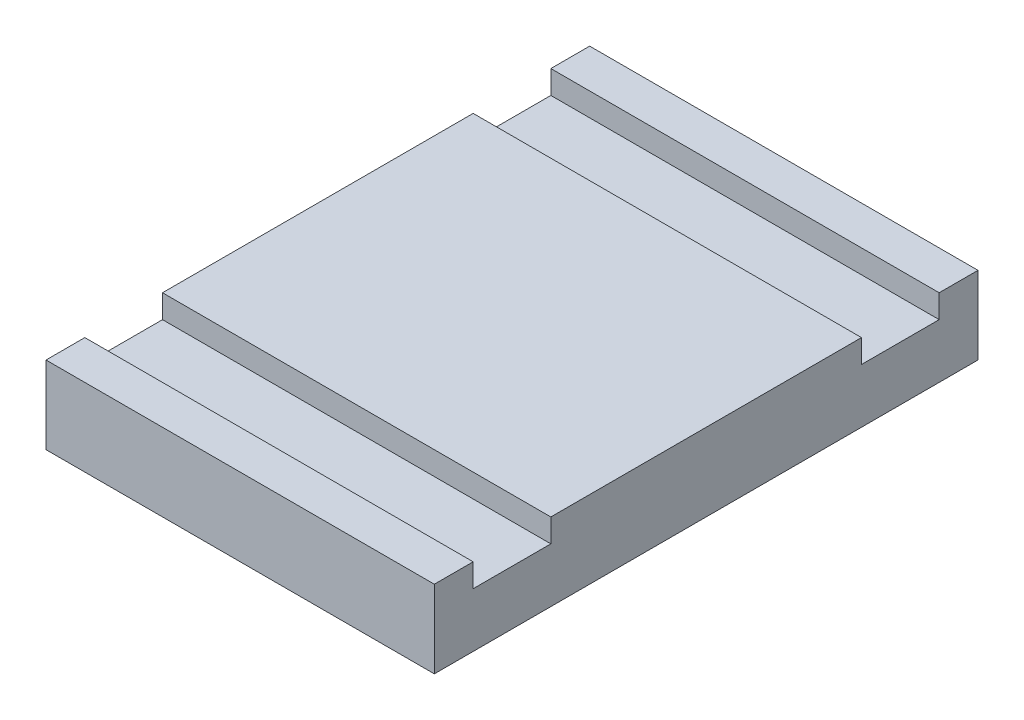
ISO-10303-21;
HEADER;
FILE_DESCRIPTION(('STEP AP214'),'2;1');
FILE_NAME('part.step','',(''),(''),'','','');
FILE_SCHEMA(('AUTOMOTIVE_DESIGN { 1 0 10303 214 1 1 1 1 }'));
ENDSEC;
DATA;
#1=APPLICATION_CONTEXT('core data for automotive mechanical design processes');
#2=APPLICATION_PROTOCOL_DEFINITION('international standard','automotive_design',2000,#1);
#3=PRODUCT_CONTEXT('',#1,'mechanical');
#4=PRODUCT('Part','Part','',(#3));
#5=PRODUCT_RELATED_PRODUCT_CATEGORY('part','',(#4));
#6=PRODUCT_DEFINITION_FORMATION('','',#4);
#7=PRODUCT_DEFINITION_CONTEXT('part definition',#1,'design');
#8=PRODUCT_DEFINITION('design','',#6,#7);
#9=PRODUCT_DEFINITION_SHAPE('','',#8);
#10=(LENGTH_UNIT() NAMED_UNIT(*) SI_UNIT(.MILLI.,.METRE.));
#11=(NAMED_UNIT(*) PLANE_ANGLE_UNIT() SI_UNIT($,.RADIAN.));
#12=(NAMED_UNIT(*) SI_UNIT($,.STERADIAN.) SOLID_ANGLE_UNIT());
#13=UNCERTAINTY_MEASURE_WITH_UNIT(LENGTH_MEASURE(1.E-05),#10,'distance_accuracy_value','');
#14=(GEOMETRIC_REPRESENTATION_CONTEXT(3) GLOBAL_UNCERTAINTY_ASSIGNED_CONTEXT((#13)) GLOBAL_UNIT_ASSIGNED_CONTEXT((#10,
#11,#12)) REPRESENTATION_CONTEXT('',''));
#15=CARTESIAN_POINT('',(0.,0.,0.));
#16=DIRECTION('',(0.,0.,1.));
#17=DIRECTION('',(1.,0.,0.));
#18=AXIS2_PLACEMENT_3D('',#15,#16,#17);
#19=CARTESIAN_POINT('',(0.,10.,0.));
#20=DIRECTION('',(0.,1.,0.));
#21=DIRECTION('',(0.,0.,1.));
#22=AXIS2_PLACEMENT_3D('',#19,#20,#21);
#23=PLANE('',#22);
#24=DIRECTION('',(-1.,0.,0.));
#25=VECTOR('',#24,1.);
#26=CARTESIAN_POINT('',(50.,10.,30.));
#27=LINE('',#26,#25);
#28=CARTESIAN_POINT('',(50.,10.,30.));
#29=VERTEX_POINT('',#28);
#30=CARTESIAN_POINT('',(0.,10.,30.));
#31=VERTEX_POINT('',#30);
#32=EDGE_CURVE('E155',#29,#31,#27,.T.);
#33=ORIENTED_EDGE('',*,*,#32,.T.);
#34=DIRECTION('',(0.,0.,1.));
#35=VECTOR('',#34,1.);
#36=CARTESIAN_POINT('',(0.,10.,-35.));
#37=LINE('',#36,#35);
#38=CARTESIAN_POINT('',(0.,10.,35.));
#39=VERTEX_POINT('',#38);
#40=EDGE_CURVE('E189',#31,#39,#37,.T.);
#41=ORIENTED_EDGE('',*,*,#40,.T.);
#42=DIRECTION('',(1.,0.,0.));
#43=VECTOR('',#42,1.);
#44=CARTESIAN_POINT('',(0.,10.,35.));
#45=LINE('',#44,#43);
#46=CARTESIAN_POINT('',(50.,10.,35.));
#47=VERTEX_POINT('',#46);
#48=EDGE_CURVE('E187',#39,#47,#45,.T.);
#49=ORIENTED_EDGE('',*,*,#48,.T.);
#50=DIRECTION('',(0.,0.,-1.));
#51=VECTOR('',#50,1.);
#52=CARTESIAN_POINT('',(50.,10.,35.));
#53=LINE('',#52,#51);
#54=EDGE_CURVE('E192',#47,#29,#53,.T.);
#55=ORIENTED_EDGE('',*,*,#54,.T.);
#56=EDGE_LOOP('',(#33,#41,#49,#55));
#57=FACE_BOUND('',#56,.T.);
#58=ADVANCED_FACE('F36',(#57),#23,.T.);
#59=DIRECTION('',(-1.,0.,0.));
#60=VECTOR('',#59,1.);
#61=CARTESIAN_POINT('',(50.,10.,-30.));
#62=LINE('',#61,#60);
#63=CARTESIAN_POINT('',(50.,10.,-30.));
#64=VERTEX_POINT('',#63);
#65=CARTESIAN_POINT('',(0.,10.,-30.));
#66=VERTEX_POINT('',#65);
#67=EDGE_CURVE('E176',#64,#66,#62,.T.);
#68=ORIENTED_EDGE('',*,*,#67,.F.);
#69=CARTESIAN_POINT('',(50.,10.,-35.));
#70=VERTEX_POINT('',#69);
#71=EDGE_CURVE('E191',#64,#70,#53,.T.);
#72=ORIENTED_EDGE('',*,*,#71,.T.);
#73=DIRECTION('',(-1.,0.,0.));
#74=VECTOR('',#73,1.);
#75=CARTESIAN_POINT('',(50.,10.,-35.));
#76=LINE('',#75,#74);
#77=CARTESIAN_POINT('',(0.,10.,-35.));
#78=VERTEX_POINT('',#77);
#79=EDGE_CURVE('E195',#70,#78,#76,.T.);
#80=ORIENTED_EDGE('',*,*,#79,.T.);
#81=EDGE_CURVE('E184',#78,#66,#37,.T.);
#82=ORIENTED_EDGE('',*,*,#81,.T.);
#83=EDGE_LOOP('',(#68,#72,#80,#82));
#84=FACE_BOUND('',#83,.T.);
#85=ADVANCED_FACE('F233',(#84),#23,.T.);
#86=CARTESIAN_POINT('',(0.,10.,-35.));
#87=DIRECTION('',(1.,0.,0.));
#88=DIRECTION('',(0.,0.,-1.));
#89=AXIS2_PLACEMENT_3D('',#86,#87,#88);
#90=PLANE('',#89);
#91=ORIENTED_EDGE('',*,*,#40,.F.);
#92=DIRECTION('',(0.,1.,0.));
#93=VECTOR('',#92,1.);
#94=CARTESIAN_POINT('',(0.,10.,30.));
#95=LINE('',#94,#93);
#96=CARTESIAN_POINT('',(0.,7.,30.));
#97=VERTEX_POINT('',#96);
#98=EDGE_CURVE('E147',#97,#31,#95,.T.);
#99=ORIENTED_EDGE('',*,*,#98,.F.);
#100=DIRECTION('',(0.,0.,1.));
#101=VECTOR('',#100,1.);
#102=CARTESIAN_POINT('',(0.,7.,30.));
#103=LINE('',#102,#101);
#104=CARTESIAN_POINT('',(0.,7.,20.));
#105=VERTEX_POINT('',#104);
#106=EDGE_CURVE('E149',#105,#97,#103,.T.);
#107=ORIENTED_EDGE('',*,*,#106,.F.);
#108=DIRECTION('',(0.,-1.,0.));
#109=VECTOR('',#108,1.);
#110=CARTESIAN_POINT('',(0.,10.,20.));
#111=LINE('',#110,#109);
#112=CARTESIAN_POINT('',(0.,10.,20.));
#113=VERTEX_POINT('',#112);
#114=EDGE_CURVE('E128',#113,#105,#111,.T.);
#115=ORIENTED_EDGE('',*,*,#114,.F.);
#116=CARTESIAN_POINT('',(0.,10.,-20.));
#117=VERTEX_POINT('',#116);
#118=EDGE_CURVE('E188',#117,#113,#37,.T.);
#119=ORIENTED_EDGE('',*,*,#118,.F.);
#120=DIRECTION('',(0.,1.,0.));
#121=VECTOR('',#120,1.);
#122=CARTESIAN_POINT('',(0.,10.,-20.));
#123=LINE('',#122,#121);
#124=CARTESIAN_POINT('',(0.,7.,-20.));
#125=VERTEX_POINT('',#124);
#126=EDGE_CURVE('E59',#125,#117,#123,.T.);
#127=ORIENTED_EDGE('',*,*,#126,.F.);
#128=DIRECTION('',(0.,0.,1.));
#129=VECTOR('',#128,1.);
#130=CARTESIAN_POINT('',(0.,7.,-30.));
#131=LINE('',#130,#129);
#132=CARTESIAN_POINT('',(0.,7.,-30.));
#133=VERTEX_POINT('',#132);
#134=EDGE_CURVE('E172',#133,#125,#131,.T.);
#135=ORIENTED_EDGE('',*,*,#134,.F.);
#136=DIRECTION('',(0.,-1.,0.));
#137=VECTOR('',#136,1.);
#138=CARTESIAN_POINT('',(0.,10.,-30.));
#139=LINE('',#138,#137);
#140=EDGE_CURVE('E158',#66,#133,#139,.T.);
#141=ORIENTED_EDGE('',*,*,#140,.F.);
#142=ORIENTED_EDGE('',*,*,#81,.F.);
#143=DIRECTION('',(0.,-1.,0.));
#144=VECTOR('',#143,1.);
#145=CARTESIAN_POINT('',(0.,10.,-35.));
#146=LINE('',#145,#144);
#147=CARTESIAN_POINT('',(0.,0.,-35.));
#148=VERTEX_POINT('',#147);
#149=EDGE_CURVE('E197',#78,#148,#146,.T.);
#150=ORIENTED_EDGE('',*,*,#149,.T.);
#151=DIRECTION('',(0.,0.,1.));
#152=VECTOR('',#151,1.);
#153=CARTESIAN_POINT('',(0.,0.,-35.));
#154=LINE('',#153,#152);
#155=CARTESIAN_POINT('',(0.,0.,35.));
#156=VERTEX_POINT('',#155);
#157=EDGE_CURVE('E178',#148,#156,#154,.T.);
#158=ORIENTED_EDGE('',*,*,#157,.T.);
#159=DIRECTION('',(0.,-1.,0.));
#160=VECTOR('',#159,1.);
#161=CARTESIAN_POINT('',(0.,10.,35.));
#162=LINE('',#161,#160);
#163=EDGE_CURVE('E11',#39,#156,#162,.T.);
#164=ORIENTED_EDGE('',*,*,#163,.F.);
#165=EDGE_LOOP('',(#91,#99,#107,#115,#119,#127,#135,#141,#142,#150,#158,#164));
#166=FACE_BOUND('',#165,.T.);
#167=ADVANCED_FACE('F38',(#166),#90,.F.);
#168=CARTESIAN_POINT('',(0.,10.,35.));
#169=DIRECTION('',(0.,0.,-1.));
#170=DIRECTION('',(-1.,0.,0.));
#171=AXIS2_PLACEMENT_3D('',#168,#169,#170);
#172=PLANE('',#171);
#173=DIRECTION('',(1.,0.,0.));
#174=VECTOR('',#173,1.);
#175=CARTESIAN_POINT('',(0.,0.,35.));
#176=LINE('',#175,#174);
#177=CARTESIAN_POINT('',(50.,0.,35.));
#178=VERTEX_POINT('',#177);
#179=EDGE_CURVE('E200',#156,#178,#176,.T.);
#180=ORIENTED_EDGE('',*,*,#179,.T.);
#181=DIRECTION('',(0.,-1.,0.));
#182=VECTOR('',#181,1.);
#183=CARTESIAN_POINT('',(50.,10.,35.));
#184=LINE('',#183,#182);
#185=EDGE_CURVE('E44',#47,#178,#184,.T.);
#186=ORIENTED_EDGE('',*,*,#185,.F.);
#187=ORIENTED_EDGE('',*,*,#48,.F.);
#188=ORIENTED_EDGE('',*,*,#163,.T.);
#189=EDGE_LOOP('',(#180,#186,#187,#188));
#190=FACE_BOUND('',#189,.T.);
#191=ADVANCED_FACE('F246',(#190),#172,.F.);
#192=CARTESIAN_POINT('',(50.,10.,35.));
#193=DIRECTION('',(-1.,0.,0.));
#194=DIRECTION('',(0.,0.,1.));
#195=AXIS2_PLACEMENT_3D('',#192,#193,#194);
#196=PLANE('',#195);
#197=DIRECTION('',(0.,0.,1.));
#198=VECTOR('',#197,1.);
#199=CARTESIAN_POINT('',(50.,7.,30.));
#200=LINE('',#199,#198);
#201=CARTESIAN_POINT('',(50.,7.,20.));
#202=VERTEX_POINT('',#201);
#203=CARTESIAN_POINT('',(50.,7.,30.));
#204=VERTEX_POINT('',#203);
#205=EDGE_CURVE('E136',#202,#204,#200,.T.);
#206=ORIENTED_EDGE('',*,*,#205,.T.);
#207=DIRECTION('',(0.,1.,0.));
#208=VECTOR('',#207,1.);
#209=CARTESIAN_POINT('',(50.,10.,30.));
#210=LINE('',#209,#208);
#211=EDGE_CURVE('E141',#204,#29,#210,.T.);
#212=ORIENTED_EDGE('',*,*,#211,.T.);
#213=ORIENTED_EDGE('',*,*,#54,.F.);
#214=ORIENTED_EDGE('',*,*,#185,.T.);
#215=DIRECTION('',(0.,0.,-1.));
#216=VECTOR('',#215,1.);
#217=CARTESIAN_POINT('',(50.,0.,35.));
#218=LINE('',#217,#216);
#219=CARTESIAN_POINT('',(50.,0.,-35.));
#220=VERTEX_POINT('',#219);
#221=EDGE_CURVE('E202',#178,#220,#218,.T.);
#222=ORIENTED_EDGE('',*,*,#221,.T.);
#223=DIRECTION('',(0.,-1.,0.));
#224=VECTOR('',#223,1.);
#225=CARTESIAN_POINT('',(50.,10.,-35.));
#226=LINE('',#225,#224);
#227=EDGE_CURVE('E208',#70,#220,#226,.T.);
#228=ORIENTED_EDGE('',*,*,#227,.F.);
#229=ORIENTED_EDGE('',*,*,#71,.F.);
#230=DIRECTION('',(0.,-1.,0.));
#231=VECTOR('',#230,1.);
#232=CARTESIAN_POINT('',(50.,10.,-30.));
#233=LINE('',#232,#231);
#234=CARTESIAN_POINT('',(50.,7.,-30.));
#235=VERTEX_POINT('',#234);
#236=EDGE_CURVE('E161',#64,#235,#233,.T.);
#237=ORIENTED_EDGE('',*,*,#236,.T.);
#238=DIRECTION('',(0.,0.,1.));
#239=VECTOR('',#238,1.);
#240=CARTESIAN_POINT('',(50.,7.,-30.));
#241=LINE('',#240,#239);
#242=CARTESIAN_POINT('',(50.,7.,-20.));
#243=VERTEX_POINT('',#242);
#244=EDGE_CURVE('E164',#235,#243,#241,.T.);
#245=ORIENTED_EDGE('',*,*,#244,.T.);
#246=DIRECTION('',(0.,1.,0.));
#247=VECTOR('',#246,1.);
#248=CARTESIAN_POINT('',(50.,10.,-20.));
#249=LINE('',#248,#247);
#250=CARTESIAN_POINT('',(50.,10.,-20.));
#251=VERTEX_POINT('',#250);
#252=EDGE_CURVE('E167',#243,#251,#249,.T.);
#253=ORIENTED_EDGE('',*,*,#252,.T.);
#254=CARTESIAN_POINT('',(50.,10.,20.));
#255=VERTEX_POINT('',#254);
#256=EDGE_CURVE('E146',#255,#251,#53,.T.);
#257=ORIENTED_EDGE('',*,*,#256,.F.);
#258=DIRECTION('',(0.,-1.,0.));
#259=VECTOR('',#258,1.);
#260=CARTESIAN_POINT('',(50.,10.,20.));
#261=LINE('',#260,#259);
#262=EDGE_CURVE('E51',#255,#202,#261,.T.);
#263=ORIENTED_EDGE('',*,*,#262,.T.);
#264=EDGE_LOOP('',(#206,#212,#213,#214,#222,#228,#229,#237,#245,#253,#257,#263));
#265=FACE_BOUND('',#264,.T.);
#266=ADVANCED_FACE('F144',(#265),#196,.F.);
#267=CARTESIAN_POINT('',(50.,10.,-35.));
#268=DIRECTION('',(0.,0.,1.));
#269=DIRECTION('',(1.,0.,0.));
#270=AXIS2_PLACEMENT_3D('',#267,#268,#269);
#271=PLANE('',#270);
#272=DIRECTION('',(-1.,0.,0.));
#273=VECTOR('',#272,1.);
#274=CARTESIAN_POINT('',(50.,0.,-35.));
#275=LINE('',#274,#273);
#276=EDGE_CURVE('E204',#220,#148,#275,.T.);
#277=ORIENTED_EDGE('',*,*,#276,.T.);
#278=ORIENTED_EDGE('',*,*,#149,.F.);
#279=ORIENTED_EDGE('',*,*,#79,.F.);
#280=ORIENTED_EDGE('',*,*,#227,.T.);
#281=EDGE_LOOP('',(#277,#278,#279,#280));
#282=FACE_BOUND('',#281,.T.);
#283=ADVANCED_FACE('F223',(#282),#271,.F.);
#284=DIRECTION('',(-1.,0.,0.));
#285=VECTOR('',#284,1.);
#286=CARTESIAN_POINT('',(50.,10.,20.));
#287=LINE('',#286,#285);
#288=EDGE_CURVE('E133',#255,#113,#287,.T.);
#289=ORIENTED_EDGE('',*,*,#288,.F.);
#290=ORIENTED_EDGE('',*,*,#256,.T.);
#291=DIRECTION('',(-1.,0.,0.));
#292=VECTOR('',#291,1.);
#293=CARTESIAN_POINT('',(50.,10.,-20.));
#294=LINE('',#293,#292);
#295=EDGE_CURVE('E179',#251,#117,#294,.T.);
#296=ORIENTED_EDGE('',*,*,#295,.T.);
#297=ORIENTED_EDGE('',*,*,#118,.T.);
#298=EDGE_LOOP('',(#289,#290,#296,#297));
#299=FACE_BOUND('',#298,.T.);
#300=ADVANCED_FACE('F236',(#299),#23,.T.);
#301=CARTESIAN_POINT('',(0.,0.,0.));
#302=DIRECTION('',(0.,1.,0.));
#303=DIRECTION('',(0.,0.,1.));
#304=AXIS2_PLACEMENT_3D('',#301,#302,#303);
#305=PLANE('',#304);
#306=ORIENTED_EDGE('',*,*,#157,.F.);
#307=ORIENTED_EDGE('',*,*,#276,.F.);
#308=ORIENTED_EDGE('',*,*,#221,.F.);
#309=ORIENTED_EDGE('',*,*,#179,.F.);
#310=EDGE_LOOP('',(#306,#307,#308,#309));
#311=FACE_BOUND('',#310,.T.);
#312=ADVANCED_FACE('F220',(#311),#305,.F.);
#313=CARTESIAN_POINT('',(50.,10.,-30.));
#314=DIRECTION('',(0.,0.,-1.));
#315=DIRECTION('',(-1.,0.,0.));
#316=AXIS2_PLACEMENT_3D('',#313,#314,#315);
#317=PLANE('',#316);
#318=ORIENTED_EDGE('',*,*,#140,.T.);
#319=DIRECTION('',(-1.,0.,0.));
#320=VECTOR('',#319,1.);
#321=CARTESIAN_POINT('',(50.,7.,-30.));
#322=LINE('',#321,#320);
#323=EDGE_CURVE('E169',#235,#133,#322,.T.);
#324=ORIENTED_EDGE('',*,*,#323,.F.);
#325=ORIENTED_EDGE('',*,*,#236,.F.);
#326=ORIENTED_EDGE('',*,*,#67,.T.);
#327=EDGE_LOOP('',(#318,#324,#325,#326));
#328=FACE_BOUND('',#327,.T.);
#329=ADVANCED_FACE('F265',(#328),#317,.F.);
#330=CARTESIAN_POINT('',(50.,10.,-20.));
#331=DIRECTION('',(0.,0.,1.));
#332=DIRECTION('',(1.,0.,0.));
#333=AXIS2_PLACEMENT_3D('',#330,#331,#332);
#334=PLANE('',#333);
#335=ORIENTED_EDGE('',*,*,#126,.T.);
#336=ORIENTED_EDGE('',*,*,#295,.F.);
#337=ORIENTED_EDGE('',*,*,#252,.F.);
#338=DIRECTION('',(-1.,0.,0.));
#339=VECTOR('',#338,1.);
#340=CARTESIAN_POINT('',(50.,7.,-20.));
#341=LINE('',#340,#339);
#342=EDGE_CURVE('E181',#243,#125,#341,.T.);
#343=ORIENTED_EDGE('',*,*,#342,.T.);
#344=EDGE_LOOP('',(#335,#336,#337,#343));
#345=FACE_BOUND('',#344,.T.);
#346=ADVANCED_FACE('F240',(#345),#334,.F.);
#347=CARTESIAN_POINT('',(50.,7.,-30.));
#348=DIRECTION('',(0.,-1.,0.));
#349=DIRECTION('',(0.,0.,-1.));
#350=AXIS2_PLACEMENT_3D('',#347,#348,#349);
#351=PLANE('',#350);
#352=ORIENTED_EDGE('',*,*,#134,.T.);
#353=ORIENTED_EDGE('',*,*,#342,.F.);
#354=ORIENTED_EDGE('',*,*,#244,.F.);
#355=ORIENTED_EDGE('',*,*,#323,.T.);
#356=EDGE_LOOP('',(#352,#353,#354,#355));
#357=FACE_BOUND('',#356,.T.);
#358=ADVANCED_FACE('F243',(#357),#351,.F.);
#359=CARTESIAN_POINT('',(50.,10.,30.));
#360=DIRECTION('',(0.,0.,1.));
#361=DIRECTION('',(0.,-1.,0.));
#362=AXIS2_PLACEMENT_3D('',#359,#360,#361);
#363=PLANE('',#362);
#364=ORIENTED_EDGE('',*,*,#98,.T.);
#365=ORIENTED_EDGE('',*,*,#32,.F.);
#366=ORIENTED_EDGE('',*,*,#211,.F.);
#367=DIRECTION('',(-1.,0.,0.));
#368=VECTOR('',#367,1.);
#369=CARTESIAN_POINT('',(50.,7.,30.));
#370=LINE('',#369,#368);
#371=EDGE_CURVE('E132',#204,#97,#370,.T.);
#372=ORIENTED_EDGE('',*,*,#371,.T.);
#373=EDGE_LOOP('',(#364,#365,#366,#372));
#374=FACE_BOUND('',#373,.T.);
#375=ADVANCED_FACE('F335',(#374),#363,.F.);
#376=CARTESIAN_POINT('',(50.,7.,30.));
#377=DIRECTION('',(0.,-1.,0.));
#378=DIRECTION('',(0.,0.,-1.));
#379=AXIS2_PLACEMENT_3D('',#376,#377,#378);
#380=PLANE('',#379);
#381=ORIENTED_EDGE('',*,*,#106,.T.);
#382=ORIENTED_EDGE('',*,*,#371,.F.);
#383=ORIENTED_EDGE('',*,*,#205,.F.);
#384=DIRECTION('',(-1.,0.,0.));
#385=VECTOR('',#384,1.);
#386=CARTESIAN_POINT('',(50.,7.,20.));
#387=LINE('',#386,#385);
#388=EDGE_CURVE('E124',#202,#105,#387,.T.);
#389=ORIENTED_EDGE('',*,*,#388,.T.);
#390=EDGE_LOOP('',(#381,#382,#383,#389));
#391=FACE_BOUND('',#390,.T.);
#392=ADVANCED_FACE('F137',(#391),#380,.F.);
#393=CARTESIAN_POINT('',(50.,10.,20.));
#394=DIRECTION('',(0.,0.,-1.));
#395=DIRECTION('',(0.,1.,0.));
#396=AXIS2_PLACEMENT_3D('',#393,#394,#395);
#397=PLANE('',#396);
#398=ORIENTED_EDGE('',*,*,#114,.T.);
#399=ORIENTED_EDGE('',*,*,#388,.F.);
#400=ORIENTED_EDGE('',*,*,#262,.F.);
#401=ORIENTED_EDGE('',*,*,#288,.T.);
#402=EDGE_LOOP('',(#398,#399,#400,#401));
#403=FACE_BOUND('',#402,.T.);
#404=ADVANCED_FACE('F126',(#403),#397,.F.);
#405=CLOSED_SHELL('',(#58,#85,#167,#191,#266,#283,#300,#312,#329,#346,#358,#375,#392,#404));
#406=MANIFOLD_SOLID_BREP('B2',#405);
#407=ADVANCED_BREP_SHAPE_REPRESENTATION('',(#18,#406),#14);
#408=SHAPE_DEFINITION_REPRESENTATION(#9,#407);
ENDSEC;
END-ISO-10303-21;
